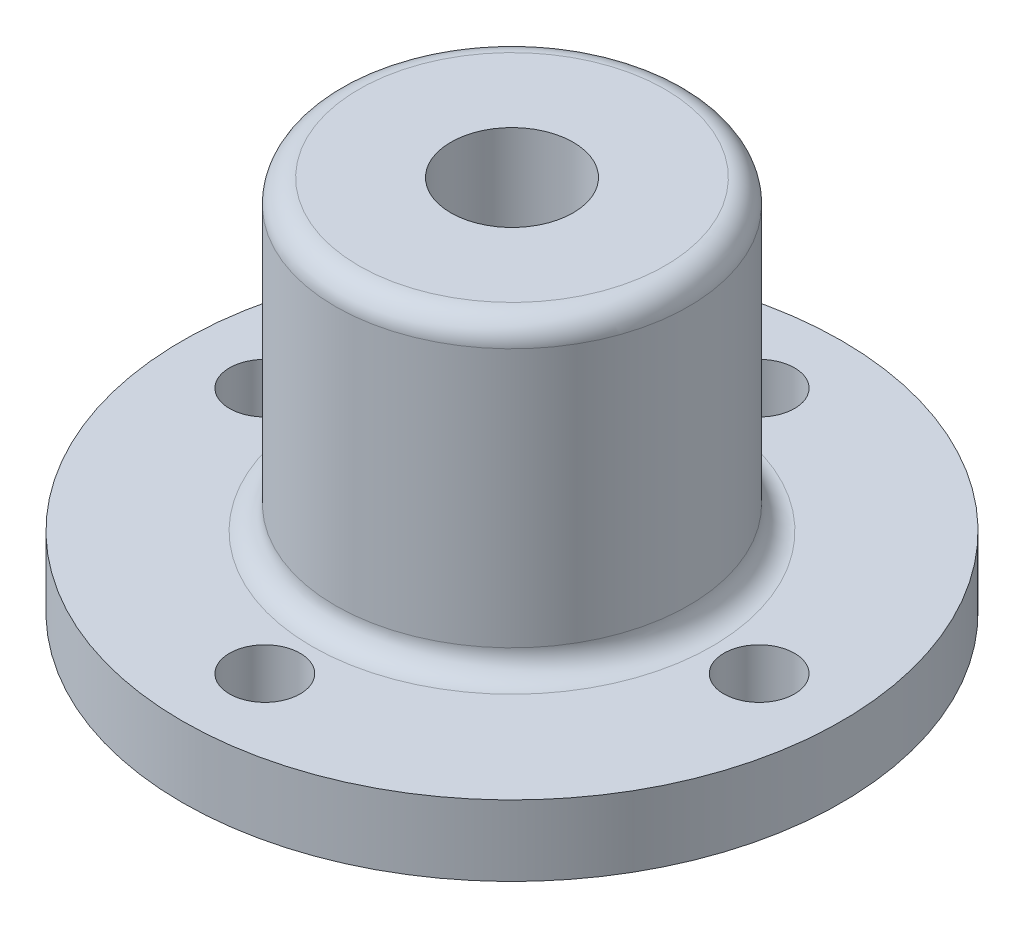
ISO-10303-21;
HEADER;
FILE_DESCRIPTION(('STEP AP214'),'2;1');
FILE_NAME('part.step','',(''),(''),'','','');
FILE_SCHEMA(('AUTOMOTIVE_DESIGN { 1 0 10303 214 1 1 1 1 }'));
ENDSEC;
DATA;
#1=APPLICATION_CONTEXT('core data for automotive mechanical design processes');
#2=APPLICATION_PROTOCOL_DEFINITION('international standard','automotive_design',2000,#1);
#3=PRODUCT_CONTEXT('',#1,'mechanical');
#4=PRODUCT('Part','Part','',(#3));
#5=PRODUCT_RELATED_PRODUCT_CATEGORY('part','',(#4));
#6=PRODUCT_DEFINITION_FORMATION('','',#4);
#7=PRODUCT_DEFINITION_CONTEXT('part definition',#1,'design');
#8=PRODUCT_DEFINITION('design','',#6,#7);
#9=PRODUCT_DEFINITION_SHAPE('','',#8);
#10=(LENGTH_UNIT() NAMED_UNIT(*) SI_UNIT(.MILLI.,.METRE.));
#11=(NAMED_UNIT(*) PLANE_ANGLE_UNIT() SI_UNIT($,.RADIAN.));
#12=(NAMED_UNIT(*) SI_UNIT($,.STERADIAN.) SOLID_ANGLE_UNIT());
#13=UNCERTAINTY_MEASURE_WITH_UNIT(LENGTH_MEASURE(1.E-05),#10,'distance_accuracy_value','');
#14=(GEOMETRIC_REPRESENTATION_CONTEXT(3) GLOBAL_UNCERTAINTY_ASSIGNED_CONTEXT((#13)) GLOBAL_UNIT_ASSIGNED_CONTEXT((#10,
#11,#12)) REPRESENTATION_CONTEXT('',''));
#15=CARTESIAN_POINT('',(0.,0.,0.));
#16=DIRECTION('',(0.,0.,1.));
#17=DIRECTION('',(1.,0.,0.));
#18=AXIS2_PLACEMENT_3D('',#15,#16,#17);
#19=CARTESIAN_POINT('',(-2.35,3.,-1.11242977306435));
#20=DIRECTION('',(1.,0.,0.));
#21=DIRECTION('',(0.,0.,-1.));
#22=AXIS2_PLACEMENT_3D('',#19,#20,#21);
#23=PLANE('',#22);
#24=DIRECTION('',(0.,-1.,0.));
#25=VECTOR('',#24,1.);
#26=CARTESIAN_POINT('',(-2.35,3.,-1.11242977306435));
#27=LINE('',#26,#25);
#28=CARTESIAN_POINT('',(-2.35,10.,-1.11242977306435));
#29=VERTEX_POINT('',#28);
#30=CARTESIAN_POINT('',(-2.35,0.,-1.11242977306435));
#31=VERTEX_POINT('',#30);
#32=EDGE_CURVE('E54',#29,#31,#27,.T.);
#33=ORIENTED_EDGE('',*,*,#32,.F.);
#34=DIRECTION('',(0.,0.,1.));
#35=VECTOR('',#34,1.);
#36=CARTESIAN_POINT('',(-2.35,10.,-1.11242977306435));
#37=LINE('',#36,#35);
#38=CARTESIAN_POINT('',(-2.35,10.,1.11242977306435));
#39=VERTEX_POINT('',#38);
#40=EDGE_CURVE('E11',#29,#39,#37,.T.);
#41=ORIENTED_EDGE('',*,*,#40,.T.);
#42=DIRECTION('',(0.,-1.,0.));
#43=VECTOR('',#42,1.);
#44=CARTESIAN_POINT('',(-2.35,3.,1.11242977306435));
#45=LINE('',#44,#43);
#46=CARTESIAN_POINT('',(-2.35,0.,1.11242977306435));
#47=VERTEX_POINT('',#46);
#48=EDGE_CURVE('E47',#39,#47,#45,.T.);
#49=ORIENTED_EDGE('',*,*,#48,.T.);
#50=DIRECTION('',(0.,0.,1.));
#51=VECTOR('',#50,1.);
#52=CARTESIAN_POINT('',(-2.35,0.,-1.11242977306435));
#53=LINE('',#52,#51);
#54=EDGE_CURVE('E68',#31,#47,#53,.T.);
#55=ORIENTED_EDGE('',*,*,#54,.F.);
#56=EDGE_LOOP('',(#33,#41,#49,#55));
#57=FACE_BOUND('',#56,.T.);
#58=ADVANCED_FACE('F33',(#57),#23,.T.);
#59=CARTESIAN_POINT('',(0.,3.,0.));
#60=DIRECTION('',(0.,1.,0.));
#61=DIRECTION('',(0.,0.,1.));
#62=AXIS2_PLACEMENT_3D('',#59,#60,#61);
#63=PLANE('',#62);
#64=CARTESIAN_POINT('',(0.,3.,0.));
#65=DIRECTION('',(0.,1.,0.));
#66=DIRECTION('',(0.,0.,1.));
#67=AXIS2_PLACEMENT_3D('',#64,#65,#66);
#68=CIRCLE('',#67,8.5);
#69=CARTESIAN_POINT('',(0.,3.,8.5));
#70=VERTEX_POINT('',#69);
#71=EDGE_CURVE('E41',#70,#70,#68,.F.);
#72=ORIENTED_EDGE('',*,*,#71,.T.);
#73=EDGE_LOOP('',(#72));
#74=FACE_BOUND('',#73,.T.);
#75=CARTESIAN_POINT('',(0.,3.,10.5));
#76=DIRECTION('',(0.,1.,0.));
#77=DIRECTION('',(0.,0.,1.));
#78=AXIS2_PLACEMENT_3D('',#75,#76,#77);
#79=CIRCLE('',#78,1.5);
#80=CARTESIAN_POINT('',(0.,3.,12.));
#81=VERTEX_POINT('',#80);
#82=EDGE_CURVE('E170',#81,#81,#79,.T.);
#83=ORIENTED_EDGE('',*,*,#82,.F.);
#84=EDGE_LOOP('',(#83));
#85=FACE_BOUND('',#84,.T.);
#86=CARTESIAN_POINT('',(0.,3.,-10.5));
#87=DIRECTION('',(0.,1.,0.));
#88=DIRECTION('',(0.,0.,1.));
#89=AXIS2_PLACEMENT_3D('',#86,#87,#88);
#90=CIRCLE('',#89,1.5);
#91=CARTESIAN_POINT('',(0.,3.,-9.));
#92=VERTEX_POINT('',#91);
#93=EDGE_CURVE('E73',#92,#92,#90,.T.);
#94=ORIENTED_EDGE('',*,*,#93,.F.);
#95=EDGE_LOOP('',(#94));
#96=FACE_BOUND('',#95,.T.);
#97=CARTESIAN_POINT('',(0.,3.,0.));
#98=DIRECTION('',(0.,1.,0.));
#99=DIRECTION('',(0.,0.,1.));
#100=AXIS2_PLACEMENT_3D('',#97,#98,#99);
#101=CIRCLE('',#100,14.);
#102=CARTESIAN_POINT('',(0.,3.,14.));
#103=VERTEX_POINT('',#102);
#104=EDGE_CURVE('E81',#103,#103,#101,.T.);
#105=ORIENTED_EDGE('',*,*,#104,.T.);
#106=EDGE_LOOP('',(#105));
#107=FACE_BOUND('',#106,.T.);
#108=CARTESIAN_POINT('',(10.5,3.,0.));
#109=DIRECTION('',(0.,1.,0.));
#110=DIRECTION('',(0.,0.,1.));
#111=AXIS2_PLACEMENT_3D('',#108,#109,#110);
#112=CIRCLE('',#111,1.5);
#113=CARTESIAN_POINT('',(10.5,3.,1.5));
#114=VERTEX_POINT('',#113);
#115=EDGE_CURVE('E174',#114,#114,#112,.T.);
#116=ORIENTED_EDGE('',*,*,#115,.F.);
#117=EDGE_LOOP('',(#116));
#118=FACE_BOUND('',#117,.T.);
#119=CARTESIAN_POINT('',(-10.5,3.,0.));
#120=DIRECTION('',(0.,1.,0.));
#121=DIRECTION('',(0.,0.,1.));
#122=AXIS2_PLACEMENT_3D('',#119,#120,#121);
#123=CIRCLE('',#122,1.5);
#124=CARTESIAN_POINT('',(-10.5,3.,1.5));
#125=VERTEX_POINT('',#124);
#126=EDGE_CURVE('E163',#125,#125,#123,.T.);
#127=ORIENTED_EDGE('',*,*,#126,.F.);
#128=EDGE_LOOP('',(#127));
#129=FACE_BOUND('',#128,.T.);
#130=ADVANCED_FACE('F97',(#74,#85,#96,#107,#118,#129),#63,.T.);
#131=CARTESIAN_POINT('',(0.,0.,0.));
#132=DIRECTION('',(0.,1.,0.));
#133=DIRECTION('',(0.,0.,1.));
#134=AXIS2_PLACEMENT_3D('',#131,#132,#133);
#135=PLANE('',#134);
#136=CARTESIAN_POINT('',(0.,0.,-10.5));
#137=DIRECTION('',(0.,1.,0.));
#138=DIRECTION('',(0.,0.,1.));
#139=AXIS2_PLACEMENT_3D('',#136,#137,#138);
#140=CIRCLE('',#139,1.5);
#141=CARTESIAN_POINT('',(0.,0.,-9.));
#142=VERTEX_POINT('',#141);
#143=EDGE_CURVE('E70',#142,#142,#140,.T.);
#144=ORIENTED_EDGE('',*,*,#143,.T.);
#145=EDGE_LOOP('',(#144));
#146=FACE_BOUND('',#145,.T.);
#147=CARTESIAN_POINT('',(0.,0.,0.));
#148=DIRECTION('',(0.,1.,0.));
#149=DIRECTION('',(0.,0.,1.));
#150=AXIS2_PLACEMENT_3D('',#147,#148,#149);
#151=CIRCLE('',#150,14.);
#152=CARTESIAN_POINT('',(0.,0.,14.));
#153=VERTEX_POINT('',#152);
#154=EDGE_CURVE('E79',#153,#153,#151,.T.);
#155=ORIENTED_EDGE('',*,*,#154,.F.);
#156=EDGE_LOOP('',(#155));
#157=FACE_BOUND('',#156,.T.);
#158=CARTESIAN_POINT('',(0.,0.,0.));
#159=DIRECTION('',(0.,1.,0.));
#160=DIRECTION('',(0.,0.,1.));
#161=AXIS2_PLACEMENT_3D('',#158,#159,#160);
#162=CIRCLE('',#161,2.6);
#163=EDGE_CURVE('E150',#47,#31,#162,.T.);
#164=ORIENTED_EDGE('',*,*,#163,.T.);
#165=ORIENTED_EDGE('',*,*,#54,.T.);
#166=EDGE_LOOP('',(#164,#165));
#167=FACE_BOUND('',#166,.T.);
#168=CARTESIAN_POINT('',(10.5,0.,0.));
#169=DIRECTION('',(0.,1.,0.));
#170=DIRECTION('',(0.,0.,1.));
#171=AXIS2_PLACEMENT_3D('',#168,#169,#170);
#172=CIRCLE('',#171,1.5);
#173=CARTESIAN_POINT('',(10.5,0.,1.5));
#174=VERTEX_POINT('',#173);
#175=EDGE_CURVE('E154',#174,#174,#172,.T.);
#176=ORIENTED_EDGE('',*,*,#175,.T.);
#177=EDGE_LOOP('',(#176));
#178=FACE_BOUND('',#177,.T.);
#179=CARTESIAN_POINT('',(0.,0.,10.5));
#180=DIRECTION('',(0.,1.,0.));
#181=DIRECTION('',(0.,0.,1.));
#182=AXIS2_PLACEMENT_3D('',#179,#180,#181);
#183=CIRCLE('',#182,1.5);
#184=CARTESIAN_POINT('',(0.,0.,12.));
#185=VERTEX_POINT('',#184);
#186=EDGE_CURVE('E158',#185,#185,#183,.T.);
#187=ORIENTED_EDGE('',*,*,#186,.T.);
#188=EDGE_LOOP('',(#187));
#189=FACE_BOUND('',#188,.T.);
#190=CARTESIAN_POINT('',(-10.5,0.,0.));
#191=DIRECTION('',(0.,1.,0.));
#192=DIRECTION('',(0.,0.,1.));
#193=AXIS2_PLACEMENT_3D('',#190,#191,#192);
#194=CIRCLE('',#193,1.5);
#195=CARTESIAN_POINT('',(-10.5,0.,1.5));
#196=VERTEX_POINT('',#195);
#197=EDGE_CURVE('E161',#196,#196,#194,.T.);
#198=ORIENTED_EDGE('',*,*,#197,.T.);
#199=EDGE_LOOP('',(#198));
#200=FACE_BOUND('',#199,.T.);
#201=ADVANCED_FACE('F124',(#146,#157,#167,#178,#189,#200),#135,.F.);
#202=CARTESIAN_POINT('',(0.,3.,0.));
#203=DIRECTION('',(0.,-1.,0.));
#204=DIRECTION('',(0.,0.,-1.));
#205=AXIS2_PLACEMENT_3D('',#202,#203,#204);
#206=CYLINDRICAL_SURFACE('',#205,14.);
#207=ORIENTED_EDGE('',*,*,#104,.F.);
#208=EDGE_LOOP('',(#207));
#209=FACE_BOUND('',#208,.T.);
#210=ORIENTED_EDGE('',*,*,#154,.T.);
#211=EDGE_LOOP('',(#210));
#212=FACE_BOUND('',#211,.T.);
#213=ADVANCED_FACE('F134',(#209,#212),#206,.T.);
#214=CARTESIAN_POINT('',(0.,3.,-10.5));
#215=DIRECTION('',(0.,-1.,0.));
#216=DIRECTION('',(0.,0.,-1.));
#217=AXIS2_PLACEMENT_3D('',#214,#215,#216);
#218=CYLINDRICAL_SURFACE('',#217,1.5);
#219=ORIENTED_EDGE('',*,*,#93,.T.);
#220=EDGE_LOOP('',(#219));
#221=FACE_BOUND('',#220,.T.);
#222=ORIENTED_EDGE('',*,*,#143,.F.);
#223=EDGE_LOOP('',(#222));
#224=FACE_BOUND('',#223,.T.);
#225=ADVANCED_FACE('F132',(#221,#224),#218,.F.);
#226=CARTESIAN_POINT('',(0.,3.,0.));
#227=DIRECTION('',(0.,-1.,0.));
#228=DIRECTION('',(0.,0.,-1.));
#229=AXIS2_PLACEMENT_3D('',#226,#227,#228);
#230=CYLINDRICAL_SURFACE('',#229,2.6);
#231=CARTESIAN_POINT('',(0.,10.,0.));
#232=DIRECTION('',(0.,1.,0.));
#233=DIRECTION('',(0.,0.,1.));
#234=AXIS2_PLACEMENT_3D('',#231,#232,#233);
#235=CIRCLE('',#234,2.6);
#236=EDGE_CURVE('E62',#29,#39,#235,.T.);
#237=ORIENTED_EDGE('',*,*,#236,.F.);
#238=ORIENTED_EDGE('',*,*,#32,.T.);
#239=ORIENTED_EDGE('',*,*,#163,.F.);
#240=ORIENTED_EDGE('',*,*,#48,.F.);
#241=EDGE_LOOP('',(#237,#238,#239,#240));
#242=FACE_BOUND('',#241,.T.);
#243=CARTESIAN_POINT('',(0.,16.,0.));
#244=DIRECTION('',(0.,1.,0.));
#245=DIRECTION('',(0.,0.,1.));
#246=AXIS2_PLACEMENT_3D('',#243,#244,#245);
#247=CIRCLE('',#246,2.6);
#248=CARTESIAN_POINT('',(0.,16.,2.6));
#249=VERTEX_POINT('',#248);
#250=EDGE_CURVE('E65',#249,#249,#247,.T.);
#251=ORIENTED_EDGE('',*,*,#250,.T.);
#252=EDGE_LOOP('',(#251));
#253=FACE_BOUND('',#252,.T.);
#254=ADVANCED_FACE('F63',(#242,#253),#230,.F.);
#255=CARTESIAN_POINT('',(10.5,3.,0.));
#256=DIRECTION('',(0.,-1.,0.));
#257=DIRECTION('',(0.,0.,-1.));
#258=AXIS2_PLACEMENT_3D('',#255,#256,#257);
#259=CYLINDRICAL_SURFACE('',#258,1.5);
#260=ORIENTED_EDGE('',*,*,#115,.T.);
#261=EDGE_LOOP('',(#260));
#262=FACE_BOUND('',#261,.T.);
#263=ORIENTED_EDGE('',*,*,#175,.F.);
#264=EDGE_LOOP('',(#263));
#265=FACE_BOUND('',#264,.T.);
#266=ADVANCED_FACE('F128',(#262,#265),#259,.F.);
#267=CARTESIAN_POINT('',(0.,3.,10.5));
#268=DIRECTION('',(0.,-1.,0.));
#269=DIRECTION('',(0.,0.,-1.));
#270=AXIS2_PLACEMENT_3D('',#267,#268,#269);
#271=CYLINDRICAL_SURFACE('',#270,1.5);
#272=ORIENTED_EDGE('',*,*,#82,.T.);
#273=EDGE_LOOP('',(#272));
#274=FACE_BOUND('',#273,.T.);
#275=ORIENTED_EDGE('',*,*,#186,.F.);
#276=EDGE_LOOP('',(#275));
#277=FACE_BOUND('',#276,.T.);
#278=ADVANCED_FACE('F186',(#274,#277),#271,.F.);
#279=CARTESIAN_POINT('',(-10.5,3.,0.));
#280=DIRECTION('',(0.,-1.,0.));
#281=DIRECTION('',(0.,0.,-1.));
#282=AXIS2_PLACEMENT_3D('',#279,#280,#281);
#283=CYLINDRICAL_SURFACE('',#282,1.5);
#284=ORIENTED_EDGE('',*,*,#126,.T.);
#285=EDGE_LOOP('',(#284));
#286=FACE_BOUND('',#285,.T.);
#287=ORIENTED_EDGE('',*,*,#197,.F.);
#288=EDGE_LOOP('',(#287));
#289=FACE_BOUND('',#288,.T.);
#290=ADVANCED_FACE('F115',(#286,#289),#283,.F.);
#291=CARTESIAN_POINT('',(0.,16.,0.));
#292=DIRECTION('',(0.,1.,0.));
#293=DIRECTION('',(0.,0.,1.));
#294=AXIS2_PLACEMENT_3D('',#291,#292,#293);
#295=PLANE('',#294);
#296=ORIENTED_EDGE('',*,*,#250,.F.);
#297=EDGE_LOOP('',(#296));
#298=FACE_BOUND('',#297,.T.);
#299=CARTESIAN_POINT('',(0.,16.,0.));
#300=DIRECTION('',(0.,1.,0.));
#301=DIRECTION('',(0.,0.,1.));
#302=AXIS2_PLACEMENT_3D('',#299,#300,#301);
#303=CIRCLE('',#302,6.5);
#304=CARTESIAN_POINT('',(0.,16.,6.5));
#305=VERTEX_POINT('',#304);
#306=EDGE_CURVE('E84',#305,#305,#303,.T.);
#307=ORIENTED_EDGE('',*,*,#306,.T.);
#308=EDGE_LOOP('',(#307));
#309=FACE_BOUND('',#308,.T.);
#310=ADVANCED_FACE('F107',(#298,#309),#295,.T.);
#311=CARTESIAN_POINT('',(0.,16.,0.));
#312=DIRECTION('',(0.,-1.,0.));
#313=DIRECTION('',(0.,0.,-1.));
#314=AXIS2_PLACEMENT_3D('',#311,#312,#313);
#315=CYLINDRICAL_SURFACE('',#314,7.5);
#316=CARTESIAN_POINT('',(0.,15.,0.));
#317=DIRECTION('',(0.,1.,0.));
#318=DIRECTION('',(0.,0.,1.));
#319=AXIS2_PLACEMENT_3D('',#316,#317,#318);
#320=CIRCLE('',#319,7.5);
#321=CARTESIAN_POINT('',(0.,15.,-7.5));
#322=VERTEX_POINT('',#321);
#323=EDGE_CURVE('E92',#322,#322,#320,.F.);
#324=CARTESIAN_POINT('',(0.,4.,0.));
#325=DIRECTION('',(0.,1.,0.));
#326=DIRECTION('',(0.,0.,1.));
#327=AXIS2_PLACEMENT_3D('',#324,#325,#326);
#328=CIRCLE('',#327,7.5);
#329=CARTESIAN_POINT('',(0.,4.,-7.5));
#330=VERTEX_POINT('',#329);
#331=EDGE_CURVE('E89',#330,#330,#328,.T.);
#332=CARTESIAN_POINT('',(0.,15.,-7.5));
#333=CARTESIAN_POINT('',(0.,14.8854166666667,-7.5));
#334=CARTESIAN_POINT('',(0.,14.7708333333333,-7.5));
#335=CARTESIAN_POINT('',(0.,14.5416666666667,-7.5));
#336=CARTESIAN_POINT('',(0.,14.4270833333333,-7.5));
#337=CARTESIAN_POINT('',(0.,14.1979166666667,-7.5));
#338=CARTESIAN_POINT('',(0.,14.0833333333333,-7.5));
#339=CARTESIAN_POINT('',(0.,13.8541666666667,-7.5));
#340=CARTESIAN_POINT('',(0.,13.7395833333333,-7.5));
#341=CARTESIAN_POINT('',(0.,13.5104166666667,-7.5));
#342=CARTESIAN_POINT('',(0.,13.3958333333333,-7.5));
#343=CARTESIAN_POINT('',(0.,13.1666666666667,-7.5));
#344=CARTESIAN_POINT('',(0.,13.0520833333333,-7.5));
#345=CARTESIAN_POINT('',(0.,12.8229166666667,-7.5));
#346=CARTESIAN_POINT('',(0.,12.7083333333333,-7.5));
#347=CARTESIAN_POINT('',(0.,12.4791666666667,-7.5));
#348=CARTESIAN_POINT('',(0.,12.3645833333333,-7.5));
#349=CARTESIAN_POINT('',(0.,12.1354166666667,-7.5));
#350=CARTESIAN_POINT('',(0.,12.0208333333333,-7.5));
#351=CARTESIAN_POINT('',(0.,11.7916666666667,-7.5));
#352=CARTESIAN_POINT('',(0.,11.6770833333333,-7.5));
#353=CARTESIAN_POINT('',(0.,11.4479166666667,-7.5));
#354=CARTESIAN_POINT('',(0.,11.3333333333333,-7.5));
#355=CARTESIAN_POINT('',(0.,11.1041666666667,-7.5));
#356=CARTESIAN_POINT('',(0.,10.9895833333333,-7.5));
#357=CARTESIAN_POINT('',(0.,10.7604166666667,-7.5));
#358=CARTESIAN_POINT('',(0.,10.6458333333333,-7.5));
#359=CARTESIAN_POINT('',(0.,10.4166666666667,-7.5));
#360=CARTESIAN_POINT('',(0.,10.3020833333333,-7.5));
#361=CARTESIAN_POINT('',(0.,10.0729166666667,-7.5));
#362=CARTESIAN_POINT('',(0.,9.95833333333333,-7.5));
#363=CARTESIAN_POINT('',(0.,9.72916666666667,-7.5));
#364=CARTESIAN_POINT('',(0.,9.61458333333333,-7.5));
#365=CARTESIAN_POINT('',(0.,9.38541666666666,-7.5));
#366=CARTESIAN_POINT('',(0.,9.27083333333333,-7.5));
#367=CARTESIAN_POINT('',(0.,9.04166666666666,-7.5));
#368=CARTESIAN_POINT('',(0.,8.92708333333333,-7.5));
#369=CARTESIAN_POINT('',(0.,8.69791666666666,-7.5));
#370=CARTESIAN_POINT('',(0.,8.58333333333333,-7.5));
#371=CARTESIAN_POINT('',(0.,8.35416666666666,-7.5));
#372=CARTESIAN_POINT('',(0.,8.23958333333333,-7.5));
#373=CARTESIAN_POINT('',(0.,8.01041666666667,-7.5));
#374=CARTESIAN_POINT('',(0.,7.89583333333333,-7.5));
#375=CARTESIAN_POINT('',(0.,7.66666666666667,-7.5));
#376=CARTESIAN_POINT('',(0.,7.55208333333333,-7.5));
#377=CARTESIAN_POINT('',(0.,7.32291666666667,-7.5));
#378=CARTESIAN_POINT('',(0.,7.20833333333333,-7.5));
#379=CARTESIAN_POINT('',(0.,6.97916666666667,-7.5));
#380=CARTESIAN_POINT('',(0.,6.86458333333333,-7.5));
#381=CARTESIAN_POINT('',(0.,6.63541666666667,-7.5));
#382=CARTESIAN_POINT('',(0.,6.52083333333333,-7.5));
#383=CARTESIAN_POINT('',(0.,6.29166666666667,-7.5));
#384=CARTESIAN_POINT('',(0.,6.17708333333333,-7.5));
#385=CARTESIAN_POINT('',(0.,5.94791666666666,-7.5));
#386=CARTESIAN_POINT('',(0.,5.83333333333333,-7.5));
#387=CARTESIAN_POINT('',(0.,5.60416666666666,-7.5));
#388=CARTESIAN_POINT('',(0.,5.48958333333333,-7.5));
#389=CARTESIAN_POINT('',(0.,5.26041666666667,-7.5));
#390=CARTESIAN_POINT('',(0.,5.14583333333333,-7.5));
#391=CARTESIAN_POINT('',(0.,4.91666666666667,-7.5));
#392=CARTESIAN_POINT('',(0.,4.80208333333333,-7.5));
#393=CARTESIAN_POINT('',(0.,4.57291666666667,-7.5));
#394=CARTESIAN_POINT('',(0.,4.45833333333333,-7.5));
#395=CARTESIAN_POINT('',(0.,4.22916666666667,-7.5));
#396=CARTESIAN_POINT('',(0.,4.11458333333333,-7.5));
#397=CARTESIAN_POINT('',(0.,4.,-7.5));
#398=B_SPLINE_CURVE_WITH_KNOTS('',3,(#332,#333,#334,#335,#336,#337,#338,#339,#340,#341,#342,
#343,#344,#345,#346,#347,#348,#349,#350,#351,#352,#353,#354,#355,#356,#357,#358,#359,#360,#361,
#362,#363,#364,#365,#366,#367,#368,#369,#370,#371,#372,#373,#374,#375,#376,#377,#378,#379,#380,
#381,#382,#383,#384,#385,#386,#387,#388,#389,#390,#391,#392,#393,#394,#395,#396,#397),
.UNSPECIFIED.,.F.,.F.,(4,2,2,2,2,2,2,2,2,2,2,2,2,2,2,2,2,2,2,2,2,2,2,2,2,2,2,2,2,2,2,2,4),(0.,
0.343749999999999,0.687499999999999,1.03125,1.375,1.71875,2.0625,2.40625,2.75,3.09375,3.4375,
3.78125,4.125,4.46875,4.8125,5.15625,5.5,5.84375,6.1875,6.53125,6.875,7.21875,7.5625,7.90625,
8.25,8.59375,8.9375,9.28125,9.625,9.96875,10.3125,10.65625,11.),.UNSPECIFIED.);
#399=EDGE_CURVE('BSEAM105',#322,#330,#398,.T.);
#400=ORIENTED_EDGE('',*,*,#323,.T.);
#401=ORIENTED_EDGE('',*,*,#331,.T.);
#402=ORIENTED_EDGE('',*,*,#399,.T.);
#403=ORIENTED_EDGE('',*,*,#399,.F.);
#404=EDGE_LOOP('',(#400,#402,#401,#403));
#405=FACE_BOUND('',#404,.T.);
#406=ADVANCED_FACE('F105',(#405),#315,.T.);
#407=CARTESIAN_POINT('',(0.,15.,0.));
#408=DIRECTION('',(0.,1.,0.));
#409=DIRECTION('',(0.,0.,1.));
#410=AXIS2_PLACEMENT_3D('',#407,#408,#409);
#411=TOROIDAL_SURFACE('',#410,6.5,1.);
#412=ORIENTED_EDGE('',*,*,#323,.F.);
#413=EDGE_LOOP('',(#412));
#414=FACE_BOUND('',#413,.T.);
#415=ORIENTED_EDGE('',*,*,#306,.F.);
#416=EDGE_LOOP('',(#415));
#417=FACE_BOUND('',#416,.T.);
#418=ADVANCED_FACE('F102',(#414,#417),#411,.T.);
#419=CARTESIAN_POINT('',(0.,4.,0.));
#420=DIRECTION('',(0.,1.,0.));
#421=DIRECTION('',(0.,0.,1.));
#422=AXIS2_PLACEMENT_3D('',#419,#420,#421);
#423=TOROIDAL_SURFACE('',#422,8.5,1.);
#424=ORIENTED_EDGE('',*,*,#71,.F.);
#425=EDGE_LOOP('',(#424));
#426=FACE_BOUND('',#425,.T.);
#427=ORIENTED_EDGE('',*,*,#331,.F.);
#428=EDGE_LOOP('',(#427));
#429=FACE_BOUND('',#428,.T.);
#430=ADVANCED_FACE('F35',(#426,#429),#423,.F.);
#431=CARTESIAN_POINT('',(0.,10.,0.));
#432=DIRECTION('',(0.,1.,0.));
#433=DIRECTION('',(0.,0.,1.));
#434=AXIS2_PLACEMENT_3D('',#431,#432,#433);
#435=PLANE('',#434);
#436=ORIENTED_EDGE('',*,*,#236,.T.);
#437=ORIENTED_EDGE('',*,*,#40,.F.);
#438=EDGE_LOOP('',(#436,#437));
#439=FACE_BOUND('',#438,.T.);
#440=ADVANCED_FACE('F61',(#439),#435,.T.);
#441=CLOSED_SHELL('',(#58,#130,#201,#213,#225,#254,#266,#278,#290,#310,#406,#418,#430,#440));
#442=MANIFOLD_SOLID_BREP('B2',#441);
#443=ADVANCED_BREP_SHAPE_REPRESENTATION('',(#18,#442),#14);
#444=SHAPE_DEFINITION_REPRESENTATION(#9,#443);
ENDSEC;
END-ISO-10303-21;
